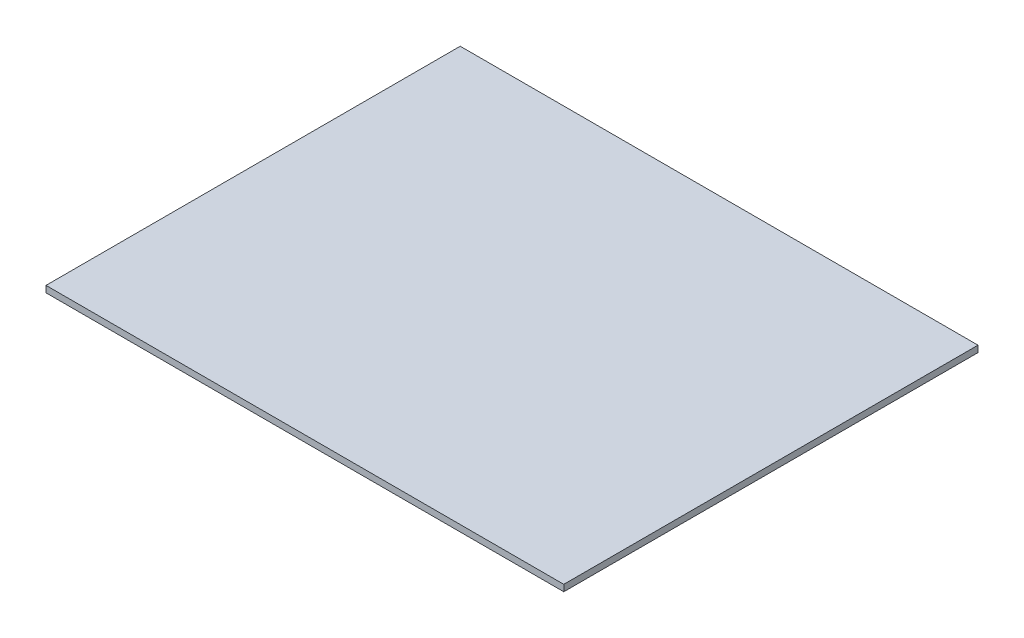
ISO-10303-21;
HEADER;
FILE_DESCRIPTION(('STEP AP214'),'2;1');
FILE_NAME('part.step','',(''),(''),'','','');
FILE_SCHEMA(('AUTOMOTIVE_DESIGN { 1 0 10303 214 1 1 1 1 }'));
ENDSEC;
DATA;
#1=APPLICATION_CONTEXT('core data for automotive mechanical design processes');
#2=APPLICATION_PROTOCOL_DEFINITION('international standard','automotive_design',2000,#1);
#3=PRODUCT_CONTEXT('',#1,'mechanical');
#4=PRODUCT('Part','Part','',(#3));
#5=PRODUCT_RELATED_PRODUCT_CATEGORY('part','',(#4));
#6=PRODUCT_DEFINITION_FORMATION('','',#4);
#7=PRODUCT_DEFINITION_CONTEXT('part definition',#1,'design');
#8=PRODUCT_DEFINITION('design','',#6,#7);
#9=PRODUCT_DEFINITION_SHAPE('','',#8);
#10=(LENGTH_UNIT() NAMED_UNIT(*) SI_UNIT(.MILLI.,.METRE.));
#11=(NAMED_UNIT(*) PLANE_ANGLE_UNIT() SI_UNIT($,.RADIAN.));
#12=(NAMED_UNIT(*) SI_UNIT($,.STERADIAN.) SOLID_ANGLE_UNIT());
#13=UNCERTAINTY_MEASURE_WITH_UNIT(LENGTH_MEASURE(1.E-05),#10,'distance_accuracy_value','');
#14=(GEOMETRIC_REPRESENTATION_CONTEXT(3) GLOBAL_UNCERTAINTY_ASSIGNED_CONTEXT((#13)) GLOBAL_UNIT_ASSIGNED_CONTEXT((#10,
#11,#12)) REPRESENTATION_CONTEXT('',''));
#15=CARTESIAN_POINT('',(0.,0.,0.));
#16=DIRECTION('',(0.,0.,1.));
#17=DIRECTION('',(1.,0.,0.));
#18=AXIS2_PLACEMENT_3D('',#15,#16,#17);
#19=CARTESIAN_POINT('',(0.,3.175,0.));
#20=DIRECTION('',(1.,0.,0.));
#21=DIRECTION('',(0.,0.,-1.));
#22=AXIS2_PLACEMENT_3D('',#19,#20,#21);
#23=PLANE('',#22);
#24=DIRECTION('',(0.,0.,1.));
#25=VECTOR('',#24,1.);
#26=CARTESIAN_POINT('',(0.,0.,0.));
#27=LINE('',#26,#25);
#28=CARTESIAN_POINT('',(0.,0.,-203.2));
#29=VERTEX_POINT('',#28);
#30=CARTESIAN_POINT('',(0.,0.,0.));
#31=VERTEX_POINT('',#30);
#32=EDGE_CURVE('E102',#29,#31,#27,.T.);
#33=ORIENTED_EDGE('',*,*,#32,.T.);
#34=DIRECTION('',(0.,-1.,0.));
#35=VECTOR('',#34,1.);
#36=CARTESIAN_POINT('',(0.,3.175,0.));
#37=LINE('',#36,#35);
#38=CARTESIAN_POINT('',(0.,3.175,0.));
#39=VERTEX_POINT('',#38);
#40=EDGE_CURVE('E11',#39,#31,#37,.T.);
#41=ORIENTED_EDGE('',*,*,#40,.F.);
#42=DIRECTION('',(0.,0.,1.));
#43=VECTOR('',#42,1.);
#44=CARTESIAN_POINT('',(0.,3.175,0.));
#45=LINE('',#44,#43);
#46=CARTESIAN_POINT('',(0.,3.175,-203.2));
#47=VERTEX_POINT('',#46);
#48=EDGE_CURVE('E90',#47,#39,#45,.T.);
#49=ORIENTED_EDGE('',*,*,#48,.F.);
#50=DIRECTION('',(0.,-1.,0.));
#51=VECTOR('',#50,1.);
#52=CARTESIAN_POINT('',(0.,3.175,-203.2));
#53=LINE('',#52,#51);
#54=EDGE_CURVE('E98',#47,#29,#53,.T.);
#55=ORIENTED_EDGE('',*,*,#54,.T.);
#56=EDGE_LOOP('',(#33,#41,#49,#55));
#57=FACE_BOUND('',#56,.T.);
#58=ADVANCED_FACE('F39',(#57),#23,.F.);
#59=CARTESIAN_POINT('',(0.,3.175,0.));
#60=DIRECTION('',(0.,0.,-1.));
#61=DIRECTION('',(-1.,0.,0.));
#62=AXIS2_PLACEMENT_3D('',#59,#60,#61);
#63=PLANE('',#62);
#64=DIRECTION('',(1.,0.,0.));
#65=VECTOR('',#64,1.);
#66=CARTESIAN_POINT('',(0.,0.,0.));
#67=LINE('',#66,#65);
#68=CARTESIAN_POINT('',(254.,0.,0.));
#69=VERTEX_POINT('',#68);
#70=EDGE_CURVE('E94',#31,#69,#67,.T.);
#71=ORIENTED_EDGE('',*,*,#70,.T.);
#72=DIRECTION('',(0.,-1.,0.));
#73=VECTOR('',#72,1.);
#74=CARTESIAN_POINT('',(254.,3.175,0.));
#75=LINE('',#74,#73);
#76=CARTESIAN_POINT('',(254.,3.175,0.));
#77=VERTEX_POINT('',#76);
#78=EDGE_CURVE('E47',#77,#69,#75,.T.);
#79=ORIENTED_EDGE('',*,*,#78,.F.);
#80=DIRECTION('',(1.,0.,0.));
#81=VECTOR('',#80,1.);
#82=CARTESIAN_POINT('',(0.,3.175,0.));
#83=LINE('',#82,#81);
#84=EDGE_CURVE('E85',#39,#77,#83,.T.);
#85=ORIENTED_EDGE('',*,*,#84,.F.);
#86=ORIENTED_EDGE('',*,*,#40,.T.);
#87=EDGE_LOOP('',(#71,#79,#85,#86));
#88=FACE_BOUND('',#87,.T.);
#89=ADVANCED_FACE('F93',(#88),#63,.F.);
#90=CARTESIAN_POINT('',(254.,3.175,0.));
#91=DIRECTION('',(-1.,0.,0.));
#92=DIRECTION('',(0.,0.,1.));
#93=AXIS2_PLACEMENT_3D('',#90,#91,#92);
#94=PLANE('',#93);
#95=DIRECTION('',(0.,0.,-1.));
#96=VECTOR('',#95,1.);
#97=CARTESIAN_POINT('',(254.,0.,0.));
#98=LINE('',#97,#96);
#99=CARTESIAN_POINT('',(254.,0.,-203.2));
#100=VERTEX_POINT('',#99);
#101=EDGE_CURVE('E72',#69,#100,#98,.T.);
#102=ORIENTED_EDGE('',*,*,#101,.T.);
#103=DIRECTION('',(0.,-1.,0.));
#104=VECTOR('',#103,1.);
#105=CARTESIAN_POINT('',(254.,3.175,-203.2));
#106=LINE('',#105,#104);
#107=CARTESIAN_POINT('',(254.,3.175,-203.2));
#108=VERTEX_POINT('',#107);
#109=EDGE_CURVE('E95',#108,#100,#106,.T.);
#110=ORIENTED_EDGE('',*,*,#109,.F.);
#111=DIRECTION('',(0.,0.,-1.));
#112=VECTOR('',#111,1.);
#113=CARTESIAN_POINT('',(254.,3.175,0.));
#114=LINE('',#113,#112);
#115=EDGE_CURVE('E88',#77,#108,#114,.T.);
#116=ORIENTED_EDGE('',*,*,#115,.F.);
#117=ORIENTED_EDGE('',*,*,#78,.T.);
#118=EDGE_LOOP('',(#102,#110,#116,#117));
#119=FACE_BOUND('',#118,.T.);
#120=ADVANCED_FACE('F96',(#119),#94,.F.);
#121=CARTESIAN_POINT('',(0.,3.175,-203.2));
#122=DIRECTION('',(0.,0.,1.));
#123=DIRECTION('',(1.,0.,0.));
#124=AXIS2_PLACEMENT_3D('',#121,#122,#123);
#125=PLANE('',#124);
#126=DIRECTION('',(-1.,0.,0.));
#127=VECTOR('',#126,1.);
#128=CARTESIAN_POINT('',(0.,0.,-203.2));
#129=LINE('',#128,#127);
#130=EDGE_CURVE('E78',#100,#29,#129,.T.);
#131=ORIENTED_EDGE('',*,*,#130,.T.);
#132=ORIENTED_EDGE('',*,*,#54,.F.);
#133=DIRECTION('',(-1.,0.,0.));
#134=VECTOR('',#133,1.);
#135=CARTESIAN_POINT('',(0.,3.175,-203.2));
#136=LINE('',#135,#134);
#137=EDGE_CURVE('E55',#108,#47,#136,.T.);
#138=ORIENTED_EDGE('',*,*,#137,.F.);
#139=ORIENTED_EDGE('',*,*,#109,.T.);
#140=EDGE_LOOP('',(#131,#132,#138,#139));
#141=FACE_BOUND('',#140,.T.);
#142=ADVANCED_FACE('F109',(#141),#125,.F.);
#143=CARTESIAN_POINT('',(0.,3.175,0.));
#144=DIRECTION('',(0.,-1.,0.));
#145=DIRECTION('',(0.,0.,-1.));
#146=AXIS2_PLACEMENT_3D('',#143,#144,#145);
#147=PLANE('',#146);
#148=ORIENTED_EDGE('',*,*,#48,.T.);
#149=ORIENTED_EDGE('',*,*,#84,.T.);
#150=ORIENTED_EDGE('',*,*,#115,.T.);
#151=ORIENTED_EDGE('',*,*,#137,.T.);
#152=EDGE_LOOP('',(#148,#149,#150,#151));
#153=FACE_BOUND('',#152,.T.);
#154=ADVANCED_FACE('F86',(#153),#147,.F.);
#155=CARTESIAN_POINT('',(0.,0.,0.));
#156=DIRECTION('',(0.,-1.,0.));
#157=DIRECTION('',(0.,0.,-1.));
#158=AXIS2_PLACEMENT_3D('',#155,#156,#157);
#159=PLANE('',#158);
#160=ORIENTED_EDGE('',*,*,#32,.F.);
#161=ORIENTED_EDGE('',*,*,#130,.F.);
#162=ORIENTED_EDGE('',*,*,#101,.F.);
#163=ORIENTED_EDGE('',*,*,#70,.F.);
#164=EDGE_LOOP('',(#160,#161,#162,#163));
#165=FACE_BOUND('',#164,.T.);
#166=ADVANCED_FACE('F112',(#165),#159,.T.);
#167=CLOSED_SHELL('',(#58,#89,#120,#142,#154,#166));
#168=MANIFOLD_SOLID_BREP('B2',#167);
#169=ADVANCED_BREP_SHAPE_REPRESENTATION('',(#18,#168),#14);
#170=SHAPE_DEFINITION_REPRESENTATION(#9,#169);
ENDSEC;
END-ISO-10303-21;
